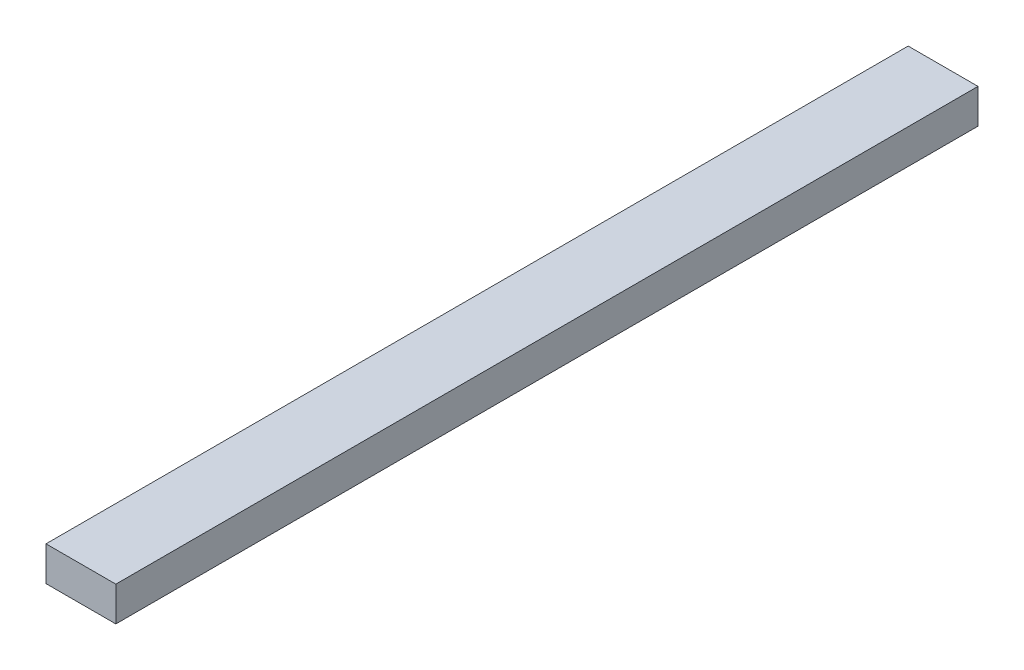
ISO-10303-21;
HEADER;
FILE_DESCRIPTION(('STEP AP214'),'2;1');
FILE_NAME('part.step','',(''),(''),'','','');
FILE_SCHEMA(('AUTOMOTIVE_DESIGN { 1 0 10303 214 1 1 1 1 }'));
ENDSEC;
DATA;
#1=APPLICATION_CONTEXT('core data for automotive mechanical design processes');
#2=APPLICATION_PROTOCOL_DEFINITION('international standard','automotive_design',2000,#1);
#3=PRODUCT_CONTEXT('',#1,'mechanical');
#4=PRODUCT('Part','Part','',(#3));
#5=PRODUCT_RELATED_PRODUCT_CATEGORY('part','',(#4));
#6=PRODUCT_DEFINITION_FORMATION('','',#4);
#7=PRODUCT_DEFINITION_CONTEXT('part definition',#1,'design');
#8=PRODUCT_DEFINITION('design','',#6,#7);
#9=PRODUCT_DEFINITION_SHAPE('','',#8);
#10=(LENGTH_UNIT() NAMED_UNIT(*) SI_UNIT(.MILLI.,.METRE.));
#11=(NAMED_UNIT(*) PLANE_ANGLE_UNIT() SI_UNIT($,.RADIAN.));
#12=(NAMED_UNIT(*) SI_UNIT($,.STERADIAN.) SOLID_ANGLE_UNIT());
#13=UNCERTAINTY_MEASURE_WITH_UNIT(LENGTH_MEASURE(1.E-05),#10,'distance_accuracy_value','');
#14=(GEOMETRIC_REPRESENTATION_CONTEXT(3) GLOBAL_UNCERTAINTY_ASSIGNED_CONTEXT((#13)) GLOBAL_UNIT_ASSIGNED_CONTEXT((#10,
#11,#12)) REPRESENTATION_CONTEXT('',''));
#15=CARTESIAN_POINT('',(0.,0.,0.));
#16=DIRECTION('',(0.,0.,1.));
#17=DIRECTION('',(1.,0.,0.));
#18=AXIS2_PLACEMENT_3D('',#15,#16,#17);
#19=CARTESIAN_POINT('',(6.075,-3.,150.));
#20=DIRECTION('',(-1.,0.,0.));
#21=DIRECTION('',(0.,0.,1.));
#22=AXIS2_PLACEMENT_3D('',#19,#20,#21);
#23=PLANE('',#22);
#24=DIRECTION('',(0.,1.,0.));
#25=VECTOR('',#24,1.);
#26=CARTESIAN_POINT('',(6.075,-3.,0.));
#27=LINE('',#26,#25);
#28=CARTESIAN_POINT('',(6.075,-3.,0.));
#29=VERTEX_POINT('',#28);
#30=CARTESIAN_POINT('',(6.075,3.,0.));
#31=VERTEX_POINT('',#30);
#32=EDGE_CURVE('E95',#29,#31,#27,.T.);
#33=ORIENTED_EDGE('',*,*,#32,.T.);
#34=DIRECTION('',(0.,0.,-1.));
#35=VECTOR('',#34,1.);
#36=CARTESIAN_POINT('',(6.075,3.,150.));
#37=LINE('',#36,#35);
#38=CARTESIAN_POINT('',(6.075,3.,150.));
#39=VERTEX_POINT('',#38);
#40=EDGE_CURVE('E11',#39,#31,#37,.T.);
#41=ORIENTED_EDGE('',*,*,#40,.F.);
#42=DIRECTION('',(0.,1.,0.));
#43=VECTOR('',#42,1.);
#44=CARTESIAN_POINT('',(6.075,-3.,150.));
#45=LINE('',#44,#43);
#46=CARTESIAN_POINT('',(6.075,-3.,150.));
#47=VERTEX_POINT('',#46);
#48=EDGE_CURVE('E83',#47,#39,#45,.T.);
#49=ORIENTED_EDGE('',*,*,#48,.F.);
#50=DIRECTION('',(0.,0.,-1.));
#51=VECTOR('',#50,1.);
#52=CARTESIAN_POINT('',(6.075,-3.,150.));
#53=LINE('',#52,#51);
#54=EDGE_CURVE('E91',#47,#29,#53,.T.);
#55=ORIENTED_EDGE('',*,*,#54,.T.);
#56=EDGE_LOOP('',(#33,#41,#49,#55));
#57=FACE_BOUND('',#56,.T.);
#58=ADVANCED_FACE('F32',(#57),#23,.F.);
#59=CARTESIAN_POINT('',(-6.075,3.,150.));
#60=DIRECTION('',(0.,-1.,0.));
#61=DIRECTION('',(0.,0.,-1.));
#62=AXIS2_PLACEMENT_3D('',#59,#60,#61);
#63=PLANE('',#62);
#64=DIRECTION('',(-1.,0.,0.));
#65=VECTOR('',#64,1.);
#66=CARTESIAN_POINT('',(-6.075,3.,0.));
#67=LINE('',#66,#65);
#68=CARTESIAN_POINT('',(-6.075,3.,0.));
#69=VERTEX_POINT('',#68);
#70=EDGE_CURVE('E87',#31,#69,#67,.T.);
#71=ORIENTED_EDGE('',*,*,#70,.T.);
#72=DIRECTION('',(0.,0.,-1.));
#73=VECTOR('',#72,1.);
#74=CARTESIAN_POINT('',(-6.075,3.,150.));
#75=LINE('',#74,#73);
#76=CARTESIAN_POINT('',(-6.075,3.,150.));
#77=VERTEX_POINT('',#76);
#78=EDGE_CURVE('E40',#77,#69,#75,.T.);
#79=ORIENTED_EDGE('',*,*,#78,.F.);
#80=DIRECTION('',(-1.,0.,0.));
#81=VECTOR('',#80,1.);
#82=CARTESIAN_POINT('',(-6.075,3.,150.));
#83=LINE('',#82,#81);
#84=EDGE_CURVE('E78',#39,#77,#83,.T.);
#85=ORIENTED_EDGE('',*,*,#84,.F.);
#86=ORIENTED_EDGE('',*,*,#40,.T.);
#87=EDGE_LOOP('',(#71,#79,#85,#86));
#88=FACE_BOUND('',#87,.T.);
#89=ADVANCED_FACE('F86',(#88),#63,.F.);
#90=CARTESIAN_POINT('',(-6.075,-3.,150.));
#91=DIRECTION('',(1.,0.,0.));
#92=DIRECTION('',(0.,0.,-1.));
#93=AXIS2_PLACEMENT_3D('',#90,#91,#92);
#94=PLANE('',#93);
#95=DIRECTION('',(0.,-1.,0.));
#96=VECTOR('',#95,1.);
#97=CARTESIAN_POINT('',(-6.075,-3.,0.));
#98=LINE('',#97,#96);
#99=CARTESIAN_POINT('',(-6.075,-3.,0.));
#100=VERTEX_POINT('',#99);
#101=EDGE_CURVE('E65',#69,#100,#98,.T.);
#102=ORIENTED_EDGE('',*,*,#101,.T.);
#103=DIRECTION('',(0.,0.,-1.));
#104=VECTOR('',#103,1.);
#105=CARTESIAN_POINT('',(-6.075,-3.,150.));
#106=LINE('',#105,#104);
#107=CARTESIAN_POINT('',(-6.075,-3.,150.));
#108=VERTEX_POINT('',#107);
#109=EDGE_CURVE('E88',#108,#100,#106,.T.);
#110=ORIENTED_EDGE('',*,*,#109,.F.);
#111=DIRECTION('',(0.,-1.,0.));
#112=VECTOR('',#111,1.);
#113=CARTESIAN_POINT('',(-6.075,-3.,150.));
#114=LINE('',#113,#112);
#115=EDGE_CURVE('E81',#77,#108,#114,.T.);
#116=ORIENTED_EDGE('',*,*,#115,.F.);
#117=ORIENTED_EDGE('',*,*,#78,.T.);
#118=EDGE_LOOP('',(#102,#110,#116,#117));
#119=FACE_BOUND('',#118,.T.);
#120=ADVANCED_FACE('F89',(#119),#94,.F.);
#121=CARTESIAN_POINT('',(-6.075,-3.,150.));
#122=DIRECTION('',(0.,1.,0.));
#123=DIRECTION('',(0.,0.,1.));
#124=AXIS2_PLACEMENT_3D('',#121,#122,#123);
#125=PLANE('',#124);
#126=DIRECTION('',(1.,0.,0.));
#127=VECTOR('',#126,1.);
#128=CARTESIAN_POINT('',(-6.075,-3.,0.));
#129=LINE('',#128,#127);
#130=EDGE_CURVE('E71',#100,#29,#129,.T.);
#131=ORIENTED_EDGE('',*,*,#130,.T.);
#132=ORIENTED_EDGE('',*,*,#54,.F.);
#133=DIRECTION('',(1.,0.,0.));
#134=VECTOR('',#133,1.);
#135=CARTESIAN_POINT('',(-6.075,-3.,150.));
#136=LINE('',#135,#134);
#137=EDGE_CURVE('E48',#108,#47,#136,.T.);
#138=ORIENTED_EDGE('',*,*,#137,.F.);
#139=ORIENTED_EDGE('',*,*,#109,.T.);
#140=EDGE_LOOP('',(#131,#132,#138,#139));
#141=FACE_BOUND('',#140,.T.);
#142=ADVANCED_FACE('F102',(#141),#125,.F.);
#143=CARTESIAN_POINT('',(0.,0.,150.));
#144=DIRECTION('',(0.,0.,-1.));
#145=DIRECTION('',(-1.,0.,0.));
#146=AXIS2_PLACEMENT_3D('',#143,#144,#145);
#147=PLANE('',#146);
#148=ORIENTED_EDGE('',*,*,#48,.T.);
#149=ORIENTED_EDGE('',*,*,#84,.T.);
#150=ORIENTED_EDGE('',*,*,#115,.T.);
#151=ORIENTED_EDGE('',*,*,#137,.T.);
#152=EDGE_LOOP('',(#148,#149,#150,#151));
#153=FACE_BOUND('',#152,.T.);
#154=ADVANCED_FACE('F79',(#153),#147,.F.);
#155=CARTESIAN_POINT('',(0.,0.,0.));
#156=DIRECTION('',(0.,0.,-1.));
#157=DIRECTION('',(-1.,0.,0.));
#158=AXIS2_PLACEMENT_3D('',#155,#156,#157);
#159=PLANE('',#158);
#160=ORIENTED_EDGE('',*,*,#32,.F.);
#161=ORIENTED_EDGE('',*,*,#130,.F.);
#162=ORIENTED_EDGE('',*,*,#101,.F.);
#163=ORIENTED_EDGE('',*,*,#70,.F.);
#164=EDGE_LOOP('',(#160,#161,#162,#163));
#165=FACE_BOUND('',#164,.T.);
#166=ADVANCED_FACE('F105',(#165),#159,.T.);
#167=CLOSED_SHELL('',(#58,#89,#120,#142,#154,#166));
#168=MANIFOLD_SOLID_BREP('B2',#167);
#169=ADVANCED_BREP_SHAPE_REPRESENTATION('',(#18,#168),#14);
#170=SHAPE_DEFINITION_REPRESENTATION(#9,#169);
ENDSEC;
END-ISO-10303-21;
